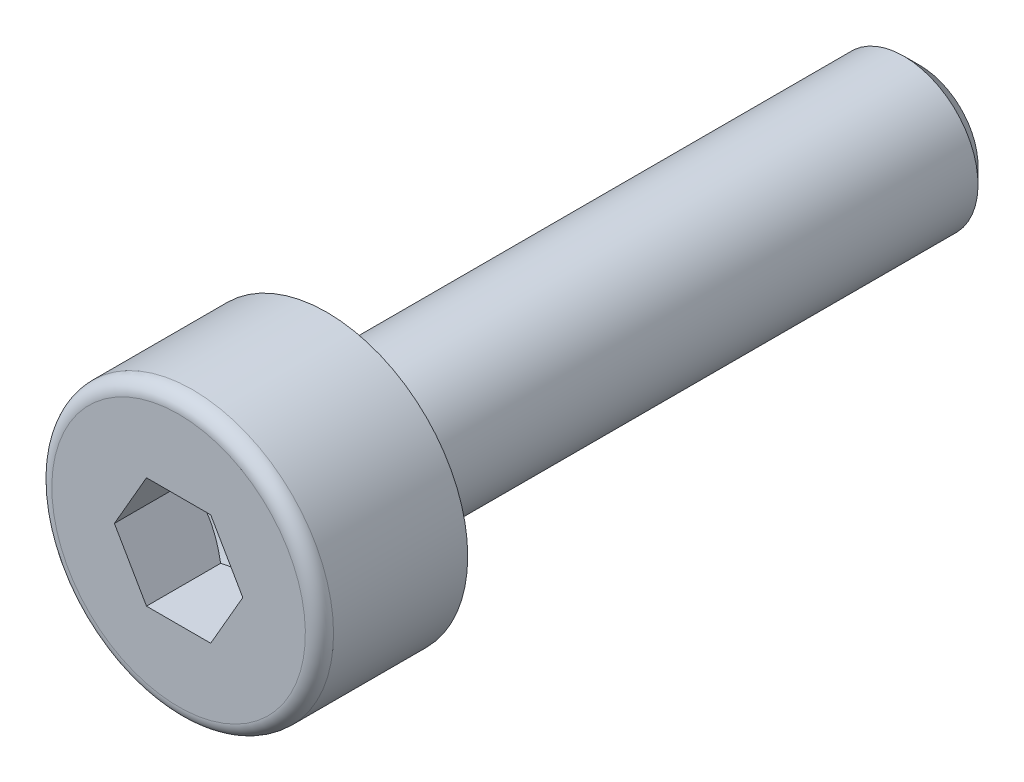
ISO-10303-21;
HEADER;
FILE_DESCRIPTION(('STEP AP214'),'2;1');
FILE_NAME('part.step','',(''),(''),'','','');
FILE_SCHEMA(('AUTOMOTIVE_DESIGN { 1 0 10303 214 1 1 1 1 }'));
ENDSEC;
DATA;
#1=APPLICATION_CONTEXT('core data for automotive mechanical design processes');
#2=APPLICATION_PROTOCOL_DEFINITION('international standard','automotive_design',2000,#1);
#3=PRODUCT_CONTEXT('',#1,'mechanical');
#4=PRODUCT('Part','Part','',(#3));
#5=PRODUCT_RELATED_PRODUCT_CATEGORY('part','',(#4));
#6=PRODUCT_DEFINITION_FORMATION('','',#4);
#7=PRODUCT_DEFINITION_CONTEXT('part definition',#1,'design');
#8=PRODUCT_DEFINITION('design','',#6,#7);
#9=PRODUCT_DEFINITION_SHAPE('','',#8);
#10=(LENGTH_UNIT() NAMED_UNIT(*) SI_UNIT(.MILLI.,.METRE.));
#11=(NAMED_UNIT(*) PLANE_ANGLE_UNIT() SI_UNIT($,.RADIAN.));
#12=(NAMED_UNIT(*) SI_UNIT($,.STERADIAN.) SOLID_ANGLE_UNIT());
#13=UNCERTAINTY_MEASURE_WITH_UNIT(LENGTH_MEASURE(1.E-05),#10,'distance_accuracy_value','');
#14=(GEOMETRIC_REPRESENTATION_CONTEXT(3) GLOBAL_UNCERTAINTY_ASSIGNED_CONTEXT((#13)) GLOBAL_UNIT_ASSIGNED_CONTEXT((#10,
#11,#12)) REPRESENTATION_CONTEXT('',''));
#15=CARTESIAN_POINT('',(0.,0.,0.));
#16=DIRECTION('',(0.,0.,1.));
#17=DIRECTION('',(1.,0.,0.));
#18=AXIS2_PLACEMENT_3D('',#15,#16,#17);
#19=CARTESIAN_POINT('',(0.,0.,0.750000116562527));
#20=DIRECTION('',(0.,0.,1.));
#21=DIRECTION('',(0.,1.,0.));
#22=AXIS2_PLACEMENT_3D('',#19,#20,#21);
#23=CONICAL_SURFACE('',#22,0.4330125,1.0471975511966);
#24=CARTESIAN_POINT('',(0.4330125,0.749999650312419,1.));
#25=CARTESIAN_POINT('',(0.64951875,0.374999825156209,0.875000058281264));
#26=CARTESIAN_POINT('',(0.866025,0.,1.));
#27=(BOUNDED_CURVE() B_SPLINE_CURVE(2,(#24,#25,#26),.UNSPECIFIED.,.F.,
.F.) B_SPLINE_CURVE_WITH_KNOTS((3,3),(0.,0.876326694970832),
.UNSPECIFIED.) CURVE() GEOMETRIC_REPRESENTATION_ITEM() RATIONAL_B_SPLINE_CURVE((1.,
1.15470053837925,1.)) REPRESENTATION_ITEM(''));
#28=CARTESIAN_POINT('',(0.4330125,0.749999650312419,1.));
#29=VERTEX_POINT('',#28);
#30=CARTESIAN_POINT('',(0.866025,0.,1.));
#31=VERTEX_POINT('',#30);
#32=EDGE_CURVE('E97',#29,#31,#27,.T.);
#33=ORIENTED_EDGE('',*,*,#32,.F.);
#34=CARTESIAN_POINT('',(-0.4330125,0.749999650312418,1.));
#35=CARTESIAN_POINT('',(0.,0.749999650312417,0.875000058281262));
#36=CARTESIAN_POINT('',(0.4330125,0.749999650312419,1.));
#37=(BOUNDED_CURVE() B_SPLINE_CURVE(2,(#34,#35,#36),.UNSPECIFIED.,.F.,
.F.) B_SPLINE_CURVE_WITH_KNOTS((3,3),(0.,0.876326694970832),
.UNSPECIFIED.) CURVE() GEOMETRIC_REPRESENTATION_ITEM() RATIONAL_B_SPLINE_CURVE((1.,
1.15470053837925,1.)) REPRESENTATION_ITEM(''));
#38=CARTESIAN_POINT('',(-0.4330125,0.749999650312418,1.));
#39=VERTEX_POINT('',#38);
#40=EDGE_CURVE('E35',#39,#29,#37,.T.);
#41=ORIENTED_EDGE('',*,*,#40,.F.);
#42=CARTESIAN_POINT('',(-0.866025,0.,1.));
#43=CARTESIAN_POINT('',(-0.64951875,0.374999825156208,0.875000058281262));
#44=CARTESIAN_POINT('',(-0.4330125,0.749999650312419,1.));
#45=(BOUNDED_CURVE() B_SPLINE_CURVE(2,(#42,#43,#44),.UNSPECIFIED.,.F.,
.F.) B_SPLINE_CURVE_WITH_KNOTS((3,3),(0.,0.876326694970832),
.UNSPECIFIED.) CURVE() GEOMETRIC_REPRESENTATION_ITEM() RATIONAL_B_SPLINE_CURVE((1.,
1.15470053837925,1.)) REPRESENTATION_ITEM(''));
#46=CARTESIAN_POINT('',(-0.866025,0.,1.));
#47=VERTEX_POINT('',#46);
#48=EDGE_CURVE('E153',#47,#39,#45,.T.);
#49=ORIENTED_EDGE('',*,*,#48,.F.);
#50=CARTESIAN_POINT('',(-0.4330125,-0.749999650312419,1.));
#51=CARTESIAN_POINT('',(-0.64951875,-0.374999825156212,0.875000058281265));
#52=CARTESIAN_POINT('',(-0.866025,0.,1.));
#53=(BOUNDED_CURVE() B_SPLINE_CURVE(2,(#50,#51,#52),.UNSPECIFIED.,.F.,
.F.) B_SPLINE_CURVE_WITH_KNOTS((3,3),(0.,0.876326694970832),
.UNSPECIFIED.) CURVE() GEOMETRIC_REPRESENTATION_ITEM() RATIONAL_B_SPLINE_CURVE((1.,
1.15470053837924,1.)) REPRESENTATION_ITEM(''));
#54=CARTESIAN_POINT('',(-0.4330125,-0.749999650312419,1.));
#55=VERTEX_POINT('',#54);
#56=EDGE_CURVE('E11',#55,#47,#53,.T.);
#57=ORIENTED_EDGE('',*,*,#56,.F.);
#58=CARTESIAN_POINT('',(0.4330125,-0.749999650312419,1.));
#59=CARTESIAN_POINT('',(0.,-0.749999650312423,0.875000058281265));
#60=CARTESIAN_POINT('',(-0.4330125,-0.749999650312419,1.));
#61=(BOUNDED_CURVE() B_SPLINE_CURVE(2,(#58,#59,#60),.UNSPECIFIED.,.F.,
.F.) B_SPLINE_CURVE_WITH_KNOTS((3,3),(0.,0.876326694970832),
.UNSPECIFIED.) CURVE() GEOMETRIC_REPRESENTATION_ITEM() RATIONAL_B_SPLINE_CURVE((1.,
1.15470053837924,1.)) REPRESENTATION_ITEM(''));
#62=CARTESIAN_POINT('',(0.4330125,-0.749999650312419,1.));
#63=VERTEX_POINT('',#62);
#64=EDGE_CURVE('E109',#63,#55,#61,.T.);
#65=ORIENTED_EDGE('',*,*,#64,.F.);
#66=CARTESIAN_POINT('',(0.866025,0.,1.));
#67=CARTESIAN_POINT('',(0.64951875,-0.37499982515621,0.875000058281264));
#68=CARTESIAN_POINT('',(0.4330125,-0.749999650312419,1.));
#69=(BOUNDED_CURVE() B_SPLINE_CURVE(2,(#66,#67,#68),.UNSPECIFIED.,.F.,
.F.) B_SPLINE_CURVE_WITH_KNOTS((3,3),(0.,0.876326694970831),
.UNSPECIFIED.) CURVE() GEOMETRIC_REPRESENTATION_ITEM() RATIONAL_B_SPLINE_CURVE((1.,
1.15470053837925,1.)) REPRESENTATION_ITEM(''));
#70=EDGE_CURVE('E107',#31,#63,#69,.T.);
#71=ORIENTED_EDGE('',*,*,#70,.F.);
#72=EDGE_LOOP('',(#33,#41,#49,#57,#65,#71));
#73=FACE_BOUND('',#72,.T.);
#74=CARTESIAN_POINT('',(0.,0.,0.500000233125054));
#75=VERTEX_POINT('',#74);
#76=VERTEX_LOOP('',#75);
#77=FACE_BOUND('',#76,.T.);
#78=ADVANCED_FACE('F16',(#73,#77),#23,.F.);
#79=CARTESIAN_POINT('',(-0.64951875,-0.374999825156209,2.));
#80=DIRECTION('',(-0.866025403784439,-0.5,0.));
#81=DIRECTION('',(-0.5,0.866025403784439,0.));
#82=AXIS2_PLACEMENT_3D('',#79,#80,#81);
#83=PLANE('',#82);
#84=ORIENTED_EDGE('',*,*,#56,.T.);
#85=DIRECTION('',(0.,0.,-1.));
#86=VECTOR('',#85,1.);
#87=CARTESIAN_POINT('',(-0.866025,0.,2.));
#88=LINE('',#87,#86);
#89=CARTESIAN_POINT('',(-0.866025,0.,2.));
#90=VERTEX_POINT('',#89);
#91=EDGE_CURVE('E159',#90,#47,#88,.T.);
#92=ORIENTED_EDGE('',*,*,#91,.F.);
#93=DIRECTION('',(-0.5,0.866025403784439,0.));
#94=VECTOR('',#93,1.);
#95=CARTESIAN_POINT('',(-0.834631680058924,-0.0543748251562093,2.));
#96=LINE('',#95,#94);
#97=CARTESIAN_POINT('',(-0.4330125,-0.749999650312419,2.));
#98=VERTEX_POINT('',#97);
#99=EDGE_CURVE('E126',#98,#90,#96,.T.);
#100=ORIENTED_EDGE('',*,*,#99,.F.);
#101=DIRECTION('',(0.,0.,-1.));
#102=VECTOR('',#101,1.);
#103=CARTESIAN_POINT('',(-0.4330125,-0.749999650312419,2.));
#104=LINE('',#103,#102);
#105=EDGE_CURVE('E26',#98,#55,#104,.T.);
#106=ORIENTED_EDGE('',*,*,#105,.T.);
#107=EDGE_LOOP('',(#84,#92,#100,#106));
#108=FACE_BOUND('',#107,.T.);
#109=ADVANCED_FACE('F196',(#108),#83,.F.);
#110=CARTESIAN_POINT('',(0.,-0.749999650312419,2.));
#111=DIRECTION('',(0.,-1.,0.));
#112=DIRECTION('',(-1.,0.,0.));
#113=AXIS2_PLACEMENT_3D('',#110,#111,#112);
#114=PLANE('',#113);
#115=ORIENTED_EDGE('',*,*,#64,.T.);
#116=ORIENTED_EDGE('',*,*,#105,.F.);
#117=DIRECTION('',(-1.,0.,0.));
#118=VECTOR('',#117,1.);
#119=CARTESIAN_POINT('',(0.,-0.749999650312419,2.));
#120=LINE('',#119,#118);
#121=CARTESIAN_POINT('',(0.4330125,-0.749999650312419,2.));
#122=VERTEX_POINT('',#121);
#123=EDGE_CURVE('E122',#122,#98,#120,.T.);
#124=ORIENTED_EDGE('',*,*,#123,.F.);
#125=DIRECTION('',(0.,0.,-1.));
#126=VECTOR('',#125,1.);
#127=CARTESIAN_POINT('',(0.4330125,-0.749999650312419,2.));
#128=LINE('',#127,#126);
#129=EDGE_CURVE('E113',#122,#63,#128,.T.);
#130=ORIENTED_EDGE('',*,*,#129,.T.);
#131=EDGE_LOOP('',(#115,#116,#124,#130));
#132=FACE_BOUND('',#131,.T.);
#133=ADVANCED_FACE('F201',(#132),#114,.F.);
#134=CARTESIAN_POINT('',(0.64951875,-0.374999825156209,2.));
#135=DIRECTION('',(0.866025403784439,-0.5,0.));
#136=DIRECTION('',(-0.5,-0.866025403784439,0.));
#137=AXIS2_PLACEMENT_3D('',#134,#135,#136);
#138=PLANE('',#137);
#139=ORIENTED_EDGE('',*,*,#70,.T.);
#140=ORIENTED_EDGE('',*,*,#129,.F.);
#141=DIRECTION('',(-0.5,-0.866025403784439,0.));
#142=VECTOR('',#141,1.);
#143=CARTESIAN_POINT('',(0.834631680058924,-0.0543748251562093,2.));
#144=LINE('',#143,#142);
#145=CARTESIAN_POINT('',(0.866025,0.,2.));
#146=VERTEX_POINT('',#145);
#147=EDGE_CURVE('E20',#146,#122,#144,.T.);
#148=ORIENTED_EDGE('',*,*,#147,.F.);
#149=DIRECTION('',(0.,0.,-1.));
#150=VECTOR('',#149,1.);
#151=CARTESIAN_POINT('',(0.866025,0.,2.));
#152=LINE('',#151,#150);
#153=EDGE_CURVE('E101',#146,#31,#152,.T.);
#154=ORIENTED_EDGE('',*,*,#153,.T.);
#155=EDGE_LOOP('',(#139,#140,#148,#154));
#156=FACE_BOUND('',#155,.T.);
#157=ADVANCED_FACE('F115',(#156),#138,.F.);
#158=CARTESIAN_POINT('',(0.64951875,0.374999825156209,2.));
#159=DIRECTION('',(0.866025403784439,0.5,0.));
#160=DIRECTION('',(0.5,-0.866025403784439,0.));
#161=AXIS2_PLACEMENT_3D('',#158,#159,#160);
#162=PLANE('',#161);
#163=ORIENTED_EDGE('',*,*,#32,.T.);
#164=ORIENTED_EDGE('',*,*,#153,.F.);
#165=DIRECTION('',(0.5,-0.866025403784439,0.));
#166=VECTOR('',#165,1.);
#167=CARTESIAN_POINT('',(0.464405819941076,0.695624825156209,2.));
#168=LINE('',#167,#166);
#169=CARTESIAN_POINT('',(0.4330125,0.749999650312419,2.));
#170=VERTEX_POINT('',#169);
#171=EDGE_CURVE('E144',#170,#146,#168,.T.);
#172=ORIENTED_EDGE('',*,*,#171,.F.);
#173=DIRECTION('',(0.,0.,-1.));
#174=VECTOR('',#173,1.);
#175=CARTESIAN_POINT('',(0.4330125,0.749999650312419,2.));
#176=LINE('',#175,#174);
#177=EDGE_CURVE('E103',#170,#29,#176,.T.);
#178=ORIENTED_EDGE('',*,*,#177,.T.);
#179=EDGE_LOOP('',(#163,#164,#172,#178));
#180=FACE_BOUND('',#179,.T.);
#181=ADVANCED_FACE('F99',(#180),#162,.F.);
#182=CARTESIAN_POINT('',(0.,0.749999650312418,2.));
#183=DIRECTION('',(0.,1.,0.));
#184=DIRECTION('',(1.,0.,0.));
#185=AXIS2_PLACEMENT_3D('',#182,#183,#184);
#186=PLANE('',#185);
#187=ORIENTED_EDGE('',*,*,#40,.T.);
#188=ORIENTED_EDGE('',*,*,#177,.F.);
#189=DIRECTION('',(1.,0.,0.));
#190=VECTOR('',#189,1.);
#191=CARTESIAN_POINT('',(0.,0.749999650312419,2.));
#192=LINE('',#191,#190);
#193=CARTESIAN_POINT('',(-0.4330125,0.749999650312418,2.));
#194=VERTEX_POINT('',#193);
#195=EDGE_CURVE('E149',#194,#170,#192,.T.);
#196=ORIENTED_EDGE('',*,*,#195,.F.);
#197=DIRECTION('',(0.,0.,-1.));
#198=VECTOR('',#197,1.);
#199=CARTESIAN_POINT('',(-0.4330125,0.749999650312418,2.));
#200=LINE('',#199,#198);
#201=EDGE_CURVE('E120',#194,#39,#200,.T.);
#202=ORIENTED_EDGE('',*,*,#201,.T.);
#203=EDGE_LOOP('',(#187,#188,#196,#202));
#204=FACE_BOUND('',#203,.T.);
#205=ADVANCED_FACE('F213',(#204),#186,.F.);
#206=CARTESIAN_POINT('',(-0.64951875,0.374999825156209,2.));
#207=DIRECTION('',(-0.866025403784439,0.5,0.));
#208=DIRECTION('',(0.5,0.866025403784439,0.));
#209=AXIS2_PLACEMENT_3D('',#206,#207,#208);
#210=PLANE('',#209);
#211=ORIENTED_EDGE('',*,*,#48,.T.);
#212=ORIENTED_EDGE('',*,*,#201,.F.);
#213=DIRECTION('',(0.5,0.866025403784439,0.));
#214=VECTOR('',#213,1.);
#215=CARTESIAN_POINT('',(-0.464405819941077,0.695624825156209,2.));
#216=LINE('',#215,#214);
#217=EDGE_CURVE('E128',#90,#194,#216,.T.);
#218=ORIENTED_EDGE('',*,*,#217,.F.);
#219=ORIENTED_EDGE('',*,*,#91,.T.);
#220=EDGE_LOOP('',(#211,#212,#218,#219));
#221=FACE_BOUND('',#220,.T.);
#222=ADVANCED_FACE('F240',(#221),#210,.F.);
#223=CARTESIAN_POINT('',(0.,0.,-3.39175));
#224=DIRECTION('',(0.,0.,1.));
#225=DIRECTION('',(0.,1.,0.));
#226=AXIS2_PLACEMENT_3D('',#223,#224,#225);
#227=CYLINDRICAL_SURFACE('',#226,1.);
#228=CARTESIAN_POINT('',(0.,0.,-7.7835));
#229=DIRECTION('',(0.,0.,-1.));
#230=DIRECTION('',(0.,1.,0.));
#231=AXIS2_PLACEMENT_3D('',#228,#229,#230);
#232=CIRCLE('',#231,1.);
#233=CARTESIAN_POINT('',(0.,1.,-7.7835));
#234=VERTEX_POINT('',#233);
#235=EDGE_CURVE('E171',#234,#234,#232,.T.);
#236=ORIENTED_EDGE('',*,*,#235,.F.);
#237=EDGE_LOOP('',(#236));
#238=FACE_BOUND('',#237,.T.);
#239=CARTESIAN_POINT('',(0.,0.,0.));
#240=DIRECTION('',(0.,0.,1.));
#241=DIRECTION('',(0.,1.,0.));
#242=AXIS2_PLACEMENT_3D('',#239,#240,#241);
#243=CIRCLE('',#242,1.);
#244=CARTESIAN_POINT('',(0.,-1.,0.));
#245=VERTEX_POINT('',#244);
#246=EDGE_CURVE('E79',#245,#245,#243,.T.);
#247=ORIENTED_EDGE('',*,*,#246,.F.);
#248=EDGE_LOOP('',(#247));
#249=FACE_BOUND('',#248,.T.);
#250=ADVANCED_FACE('F205',(#238,#249),#227,.T.);
#251=CARTESIAN_POINT('',(0.,0.,-7.89175));
#252=DIRECTION('',(0.,0.,1.));
#253=DIRECTION('',(0.,1.,0.));
#254=AXIS2_PLACEMENT_3D('',#251,#252,#253);
#255=CONICAL_SURFACE('',#254,0.89175,0.785398163397449);
#256=CARTESIAN_POINT('',(0.,0.,-8.));
#257=DIRECTION('',(0.,0.,-1.));
#258=DIRECTION('',(0.,1.,0.));
#259=AXIS2_PLACEMENT_3D('',#256,#257,#258);
#260=CIRCLE('',#259,0.7835);
#261=CARTESIAN_POINT('',(0.,0.7835,-8.));
#262=VERTEX_POINT('',#261);
#263=EDGE_CURVE('E86',#262,#262,#260,.T.);
#264=ORIENTED_EDGE('',*,*,#263,.F.);
#265=EDGE_LOOP('',(#264));
#266=FACE_BOUND('',#265,.T.);
#267=ORIENTED_EDGE('',*,*,#235,.T.);
#268=EDGE_LOOP('',(#267));
#269=FACE_BOUND('',#268,.T.);
#270=ADVANCED_FACE('F192',(#266,#269),#255,.T.);
#271=CARTESIAN_POINT('',(0.,0.39175,-8.));
#272=DIRECTION('',(0.,0.,-1.));
#273=DIRECTION('',(0.,1.,0.));
#274=AXIS2_PLACEMENT_3D('',#271,#272,#273);
#275=PLANE('',#274);
#276=ORIENTED_EDGE('',*,*,#263,.T.);
#277=EDGE_LOOP('',(#276));
#278=FACE_BOUND('',#277,.T.);
#279=ADVANCED_FACE('F186',(#278),#275,.T.);
#280=CARTESIAN_POINT('',(0.,0.855,2.));
#281=DIRECTION('',(0.,0.,1.));
#282=DIRECTION('',(0.,-1.,0.));
#283=AXIS2_PLACEMENT_3D('',#280,#281,#282);
#284=PLANE('',#283);
#285=ORIENTED_EDGE('',*,*,#99,.T.);
#286=ORIENTED_EDGE('',*,*,#217,.T.);
#287=ORIENTED_EDGE('',*,*,#195,.T.);
#288=ORIENTED_EDGE('',*,*,#171,.T.);
#289=ORIENTED_EDGE('',*,*,#147,.T.);
#290=ORIENTED_EDGE('',*,*,#123,.T.);
#291=EDGE_LOOP('',(#285,#286,#287,#288,#289,#290));
#292=FACE_BOUND('',#291,.T.);
#293=CARTESIAN_POINT('',(0.,0.,2.));
#294=DIRECTION('',(0.,0.,-1.));
#295=DIRECTION('',(0.,1.,0.));
#296=AXIS2_PLACEMENT_3D('',#293,#294,#295);
#297=CIRCLE('',#296,1.71);
#298=CARTESIAN_POINT('',(0.,1.71,2.));
#299=VERTEX_POINT('',#298);
#300=EDGE_CURVE('E125',#299,#299,#297,.T.);
#301=ORIENTED_EDGE('',*,*,#300,.F.);
#302=EDGE_LOOP('',(#301));
#303=FACE_BOUND('',#302,.T.);
#304=ADVANCED_FACE('F18',(#292,#303),#284,.T.);
#305=CARTESIAN_POINT('',(0.,0.,1.81));
#306=DIRECTION('',(0.,0.,-1.));
#307=DIRECTION('',(-1.,0.,0.));
#308=AXIS2_PLACEMENT_3D('',#305,#306,#307);
#309=TOROIDAL_SURFACE('',#308,1.71,0.19);
#310=CARTESIAN_POINT('',(0.,0.,1.81));
#311=DIRECTION('',(0.,0.,-1.));
#312=DIRECTION('',(0.,1.,0.));
#313=AXIS2_PLACEMENT_3D('',#310,#311,#312);
#314=CIRCLE('',#313,1.9);
#315=CARTESIAN_POINT('',(0.,1.9,1.81));
#316=VERTEX_POINT('',#315);
#317=EDGE_CURVE('E129',#316,#316,#314,.T.);
#318=ORIENTED_EDGE('',*,*,#317,.F.);
#319=EDGE_LOOP('',(#318));
#320=FACE_BOUND('',#319,.T.);
#321=ORIENTED_EDGE('',*,*,#300,.T.);
#322=EDGE_LOOP('',(#321));
#323=FACE_BOUND('',#322,.T.);
#324=ADVANCED_FACE('F179',(#320,#323),#309,.T.);
#325=CARTESIAN_POINT('',(0.,0.,0.905));
#326=DIRECTION('',(0.,0.,1.));
#327=DIRECTION('',(0.,1.,0.));
#328=AXIS2_PLACEMENT_3D('',#325,#326,#327);
#329=CYLINDRICAL_SURFACE('',#328,1.9);
#330=CARTESIAN_POINT('',(0.,0.,0.));
#331=DIRECTION('',(0.,0.,-1.));
#332=DIRECTION('',(0.,1.,0.));
#333=AXIS2_PLACEMENT_3D('',#330,#331,#332);
#334=CIRCLE('',#333,1.9);
#335=CARTESIAN_POINT('',(0.,1.9,0.));
#336=VERTEX_POINT('',#335);
#337=EDGE_CURVE('E139',#336,#336,#334,.T.);
#338=ORIENTED_EDGE('',*,*,#337,.F.);
#339=EDGE_LOOP('',(#338));
#340=FACE_BOUND('',#339,.T.);
#341=ORIENTED_EDGE('',*,*,#317,.T.);
#342=EDGE_LOOP('',(#341));
#343=FACE_BOUND('',#342,.T.);
#344=ADVANCED_FACE('F176',(#340,#343),#329,.T.);
#345=CARTESIAN_POINT('',(0.,0.95,0.));
#346=DIRECTION('',(0.,0.,-1.));
#347=DIRECTION('',(0.,1.,0.));
#348=AXIS2_PLACEMENT_3D('',#345,#346,#347);
#349=PLANE('',#348);
#350=ORIENTED_EDGE('',*,*,#246,.T.);
#351=EDGE_LOOP('',(#350));
#352=FACE_BOUND('',#351,.T.);
#353=ORIENTED_EDGE('',*,*,#337,.T.);
#354=EDGE_LOOP('',(#353));
#355=FACE_BOUND('',#354,.T.);
#356=ADVANCED_FACE('F174',(#352,#355),#349,.T.);
#357=CLOSED_SHELL('',(#78,#109,#133,#157,#181,#205,#222,#250,#270,#279,#304,#324,#344,#356));
#358=MANIFOLD_SOLID_BREP('B1',#357);
#359=ADVANCED_BREP_SHAPE_REPRESENTATION('',(#18,#358),#14);
#360=SHAPE_DEFINITION_REPRESENTATION(#9,#359);
ENDSEC;
END-ISO-10303-21;
